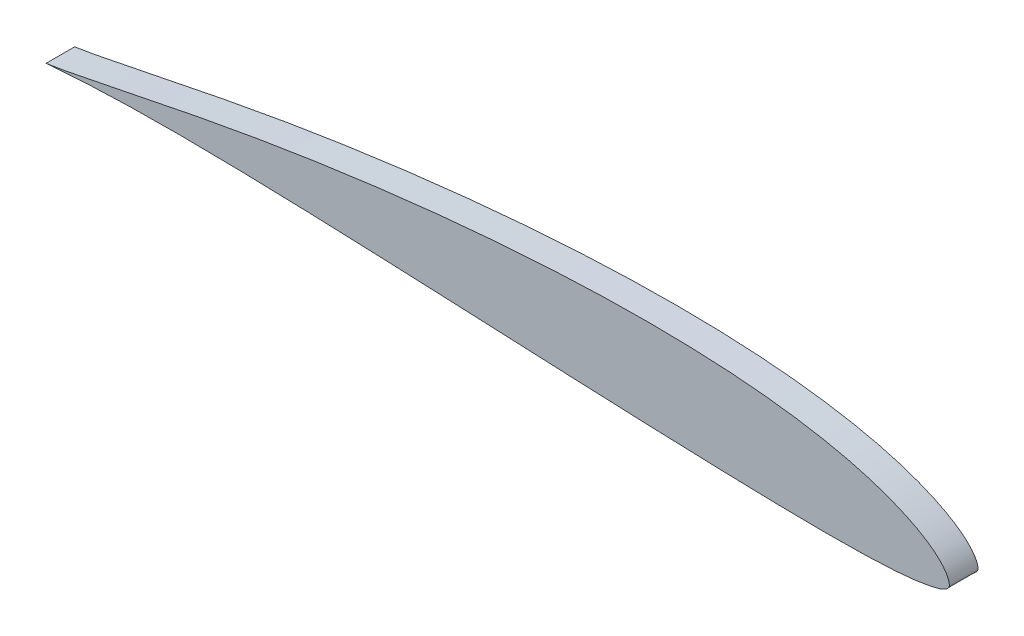
ISO-10303-21;
HEADER;
FILE_DESCRIPTION(('STEP AP214'),'2;1');
FILE_NAME('part.step','',(''),(''),'','','');
FILE_SCHEMA(('AUTOMOTIVE_DESIGN { 1 0 10303 214 1 1 1 1 }'));
ENDSEC;
DATA;
#1=APPLICATION_CONTEXT('core data for automotive mechanical design processes');
#2=APPLICATION_PROTOCOL_DEFINITION('international standard','automotive_design',2000,#1);
#3=PRODUCT_CONTEXT('',#1,'mechanical');
#4=PRODUCT('Part','Part','',(#3));
#5=PRODUCT_RELATED_PRODUCT_CATEGORY('part','',(#4));
#6=PRODUCT_DEFINITION_FORMATION('','',#4);
#7=PRODUCT_DEFINITION_CONTEXT('part definition',#1,'design');
#8=PRODUCT_DEFINITION('design','',#6,#7);
#9=PRODUCT_DEFINITION_SHAPE('','',#8);
#10=(LENGTH_UNIT() NAMED_UNIT(*) SI_UNIT(.MILLI.,.METRE.));
#11=(NAMED_UNIT(*) PLANE_ANGLE_UNIT() SI_UNIT($,.RADIAN.));
#12=(NAMED_UNIT(*) SI_UNIT($,.STERADIAN.) SOLID_ANGLE_UNIT());
#13=UNCERTAINTY_MEASURE_WITH_UNIT(LENGTH_MEASURE(1.E-05),#10,'distance_accuracy_value','');
#14=(GEOMETRIC_REPRESENTATION_CONTEXT(3) GLOBAL_UNCERTAINTY_ASSIGNED_CONTEXT((#13)) GLOBAL_UNIT_ASSIGNED_CONTEXT((#10,
#11,#12)) REPRESENTATION_CONTEXT('',''));
#15=CARTESIAN_POINT('',(0.,0.,0.));
#16=DIRECTION('',(0.,0.,1.));
#17=DIRECTION('',(1.,0.,0.));
#18=AXIS2_PLACEMENT_3D('',#15,#16,#17);
#19=CARTESIAN_POINT('',(2.3575779570362,55.8360552784786,6.35));
#20=DIRECTION('',(-0.0421856308777922,-0.999109790036832,0.));
#21=DIRECTION('',(0.999109790036832,-0.0421856308777922,0.));
#22=AXIS2_PLACEMENT_3D('',#19,#20,#21);
#23=PLANE('',#22);
#24=CARTESIAN_POINT('',(1754.97498737325,-18.165092384081,0.));
#25=DIRECTION('',(-0.0421856308777922,-0.999109790036832,0.));
#26=DIRECTION('',(0.999109790036832,-0.0421856308777922,0.));
#27=AXIS2_PLACEMENT_3D('',#24,#25,#26);
#28=ELLIPSE('',#27,3.17538763875182,3.17499999999999);
#29=CARTESIAN_POINT('',(1758.14754825028,-18.2990481149033,0.));
#30=VERTEX_POINT('',#29);
#31=EDGE_CURVE('E44',#30,#30,#28,.T.);
#32=ORIENTED_EDGE('',*,*,#31,.F.);
#33=EDGE_LOOP('',(#32));
#34=FACE_BOUND('',#33,.T.);
#35=DIRECTION('',(-0.999109790036832,0.0421856308777922,0.));
#36=VECTOR('',#35,1.);
#37=CARTESIAN_POINT('',(2.3575779570362,55.8360552784786,-6.35));
#38=LINE('',#37,#36);
#39=CARTESIAN_POINT('',(1767.6652308814,-18.7009153073702,-6.35));
#40=VERTEX_POINT('',#39);
#41=CARTESIAN_POINT('',(1742.28784221446,-17.6294002830741,-6.35));
#42=VERTEX_POINT('',#41);
#43=EDGE_CURVE('E149',#40,#42,#38,.T.);
#44=ORIENTED_EDGE('',*,*,#43,.F.);
#45=DIRECTION('',(0.,0.,-1.));
#46=VECTOR('',#45,1.);
#47=CARTESIAN_POINT('',(1767.6652308814,-18.7009153073702,6.35));
#48=LINE('',#47,#46);
#49=CARTESIAN_POINT('',(1767.6652308814,-18.7009153073702,6.35));
#50=VERTEX_POINT('',#49);
#51=EDGE_CURVE('E11',#50,#40,#48,.T.);
#52=ORIENTED_EDGE('',*,*,#51,.F.);
#53=DIRECTION('',(-0.999109790036832,0.0421856308777922,0.));
#54=VECTOR('',#53,1.);
#55=CARTESIAN_POINT('',(2.3575779570362,55.8360552784786,6.35));
#56=LINE('',#55,#54);
#57=CARTESIAN_POINT('',(1742.28784221446,-17.6294002830741,6.35));
#58=VERTEX_POINT('',#57);
#59=EDGE_CURVE('E110',#50,#58,#56,.T.);
#60=ORIENTED_EDGE('',*,*,#59,.T.);
#61=DIRECTION('',(0.,0.,-1.));
#62=VECTOR('',#61,1.);
#63=CARTESIAN_POINT('',(1742.28784221446,-17.6294002830741,6.35));
#64=LINE('',#63,#62);
#65=EDGE_CURVE('E81',#58,#42,#64,.T.);
#66=ORIENTED_EDGE('',*,*,#65,.T.);
#67=EDGE_LOOP('',(#44,#52,#60,#66));
#68=FACE_BOUND('',#67,.T.);
#69=ADVANCED_FACE('F41',(#34,#68),#23,.T.);
#70=CARTESIAN_POINT('',(1596.31021413288,-17.478209275154,6.35));
#71=CARTESIAN_POINT('',(1596.3102515309,-17.4900798795625,6.35));
#72=CARTESIAN_POINT('',(1599.1322423313,-17.2022330923903,6.35));
#73=CARTESIAN_POINT('',(1602.03182260984,-16.9907136810287,6.35));
#74=CARTESIAN_POINT('',(1609.10720109062,-16.4816305190965,6.35));
#75=CARTESIAN_POINT('',(1617.84346830049,-16.0122581327614,6.35));
#76=CARTESIAN_POINT('',(1629.29972086853,-15.5760026593076,6.35));
#77=CARTESIAN_POINT('',(1642.81673493414,-15.3091150572676,6.35));
#78=CARTESIAN_POINT('',(1658.33448053557,-15.2864051468592,6.35));
#79=CARTESIAN_POINT('',(1675.53154740055,-15.4897580032224,6.35));
#80=CARTESIAN_POINT('',(1694.16050142952,-15.9168759779006,6.35));
#81=CARTESIAN_POINT('',(1713.95156909246,-16.5363404784246,6.35));
#82=CARTESIAN_POINT('',(1734.64638447524,-17.3145316205594,6.35));
#83=CARTESIAN_POINT('',(1755.98575421537,-18.1841042418055,6.35));
#84=CARTESIAN_POINT('',(1777.70838338736,-19.1419446781197,6.35));
#85=CARTESIAN_POINT('',(1799.55769772036,-20.1293541585242,6.35));
#86=CARTESIAN_POINT('',(1821.2831429715,-21.1012838048597,6.35));
#87=CARTESIAN_POINT('',(1842.64516709738,-22.0116275533366,6.35));
#88=CARTESIAN_POINT('',(1863.40548202887,-22.8529134431896,6.35));
#89=CARTESIAN_POINT('',(1883.33023430574,-23.5822681473132,6.35));
#90=CARTESIAN_POINT('',(1902.18807730714,-24.1899386424968,6.35));
#91=CARTESIAN_POINT('',(1919.75949569216,-24.6424497284501,6.35));
#92=CARTESIAN_POINT('',(1935.8518352752,-24.8793410332257,6.35));
#93=CARTESIAN_POINT('',(1950.29422526534,-24.8739135013043,6.35));
#94=CARTESIAN_POINT('',(1962.94157873014,-24.6070759190933,6.35));
#95=CARTESIAN_POINT('',(1973.68021727723,-24.0183120574947,6.35));
#96=CARTESIAN_POINT('',(1982.39869388507,-23.1985552094744,6.35));
#97=CARTESIAN_POINT('',(1989.09296287627,-21.9114816071557,6.35));
#98=CARTESIAN_POINT('',(1993.57350987807,-20.7570563820821,6.35));
#99=CARTESIAN_POINT('',(1996.6806748032,-18.4574056102938,6.35));
#100=CARTESIAN_POINT('',(1995.81152486995,-15.0236569753175,6.35));
#101=CARTESIAN_POINT('',(1993.77484340238,-11.7907350557363,6.35));
#102=CARTESIAN_POINT('',(1990.03603736107,-8.11350883684481,6.35));
#103=CARTESIAN_POINT('',(1984.73373764165,-4.43183126644344,6.35));
#104=CARTESIAN_POINT('',(1977.84455466072,-0.738000891407876,6.35));
#105=CARTESIAN_POINT('',(1969.41765671903,2.8082946719217,6.35));
#106=CARTESIAN_POINT('',(1959.49253908317,6.11304090342494,6.35));
#107=CARTESIAN_POINT('',(1948.10296055372,9.02941444658797,6.35));
#108=CARTESIAN_POINT('',(1935.32435887673,11.5243026466393,6.35));
#109=CARTESIAN_POINT('',(1921.24125431776,13.586927955176,6.35));
#110=CARTESIAN_POINT('',(1905.94807917216,15.1257003058072,6.35));
#111=CARTESIAN_POINT('',(1889.56068995788,16.1513180356543,6.35));
#112=CARTESIAN_POINT('',(1872.20952379832,16.6653210663825,6.35));
#113=CARTESIAN_POINT('',(1854.04601062752,16.6739586592146,6.35));
#114=CARTESIAN_POINT('',(1835.23493639232,16.1998909506919,6.35));
#115=CARTESIAN_POINT('',(1815.95077146485,15.2635327555171,6.35));
#116=CARTESIAN_POINT('',(1796.37573706149,13.9033351938215,6.35));
#117=CARTESIAN_POINT('',(1776.70299506491,12.1582992439741,6.35));
#118=CARTESIAN_POINT('',(1757.13134712081,10.0744625588622,6.35));
#119=CARTESIAN_POINT('',(1737.85939642865,7.71225563047655,6.35));
#120=CARTESIAN_POINT('',(1719.08684801041,5.11473875154889,6.35));
#121=CARTESIAN_POINT('',(1701.00473801196,2.34073982283165,6.35));
#122=CARTESIAN_POINT('',(1683.79671044662,-0.560040691334636,6.35));
#123=CARTESIAN_POINT('',(1667.62831922199,-3.51396391232352,6.35));
#124=CARTESIAN_POINT('',(1652.66782034166,-6.42930574927058,6.35));
#125=CARTESIAN_POINT('',(1639.06708513807,-9.19163881630794,6.35));
#126=CARTESIAN_POINT('',(1627.05920043915,-11.6691543312357,6.35));
#127=CARTESIAN_POINT('',(1616.68795805122,-13.7848214634737,6.35));
#128=CARTESIAN_POINT('',(1608.59256465579,-15.3932547451612,6.35));
#129=CARTESIAN_POINT('',(1601.88092298677,-16.5823188951291,6.35));
#130=CARTESIAN_POINT('',(1599.08053019508,-17.0906211344314,6.35));
#131=CARTESIAN_POINT('',(1596.31017694321,-17.466404802761,6.35));
#132=CARTESIAN_POINT('',(1596.31021413288,-17.478209275154,6.35));
#133=B_SPLINE_CURVE_WITH_KNOTS('',3,(#70,#71,#72,#73,#74,#75,#76,#77,#78,#79,#80,#81,#82,#83,
#84,#85,#86,#87,#88,#89,#90,#91,#92,#93,#94,#95,#96,#97,#98,#99,#100,#101,#102,#103,#104,#105,
#106,#107,#108,#109,#110,#111,#112,#113,#114,#115,#116,#117,#118,#119,#120,#121,#122,#123,#124,
#125,#126,#127,#128,#129,#130,#131,#132),.UNSPECIFIED.,.T.,.F.,(4,1,1,1,1,1,1,1,1,1,1,1,1,1,1,1,
1,1,1,1,1,1,1,1,1,1,1,1,1,1,1,1,1,1,1,1,1,1,1,1,1,1,1,1,1,1,1,1,1,1,1,1,1,1,1,1,1,1,1,1,4),(0.,
0.00162827255922005,0.00649050965473852,0.0145193836673184,0.0256267718050507,
0.0396659782037578,0.0564158680126472,0.0755751983771271,0.0968144767188099,0.119812493963671,
0.1442464295869,0.169791911279109,0.196137839472828,0.222959252874957,0.249929689016993,
0.276747064878309,0.303109783270562,0.328732166600227,0.353323186514224,0.376592645275716,
0.398269788623994,0.418104249413604,0.435907310477593,0.451493631474574,0.464728190365783,
0.47551563303222,0.483813435244795,0.489622354181594,0.493000170515783,0.496319033276272,
0.50112136018567,0.507407277714504,0.515327375532837,0.52490812765617,0.536144750255862,
0.548990967810824,0.563425422459707,0.57944589810611,0.596955554448896,0.615864818248053,
0.636077717109341,0.657458391249912,0.679831384800272,0.703012205861105,0.726802900260427,
0.750982325596448,0.77532642647073,0.799588584319813,0.823519224580182,0.846883028826477,
0.869432574938011,0.890938901752127,0.911197778131604,0.930003617124546,0.947123678392186,
0.962312644452633,0.975299445140062,0.985817342446044,0.993591880191323,0.99838079866768,1.),.UNSPECIFIED.);
#134=DIRECTION('',(0.,0.,-1.));
#135=VECTOR('',#134,1.);
#136=SURFACE_OF_LINEAR_EXTRUSION('',#133,#135);
#137=CARTESIAN_POINT('',(1596.31021413288,-17.478209275154,-6.35));
#138=CARTESIAN_POINT('',(1596.3102515309,-17.4900798795625,-6.35));
#139=CARTESIAN_POINT('',(1599.1322423313,-17.2022330923903,-6.35));
#140=CARTESIAN_POINT('',(1602.03182260984,-16.9907136810287,-6.35));
#141=CARTESIAN_POINT('',(1609.10720109062,-16.4816305190965,-6.35));
#142=CARTESIAN_POINT('',(1617.84346830049,-16.0122581327614,-6.35));
#143=CARTESIAN_POINT('',(1629.29972086853,-15.5760026593076,-6.35));
#144=CARTESIAN_POINT('',(1642.81673493414,-15.3091150572676,-6.35));
#145=CARTESIAN_POINT('',(1658.33448053557,-15.2864051468592,-6.35));
#146=CARTESIAN_POINT('',(1675.53154740055,-15.4897580032224,-6.35));
#147=CARTESIAN_POINT('',(1694.16050142952,-15.9168759779006,-6.35));
#148=CARTESIAN_POINT('',(1713.95156909246,-16.5363404784246,-6.35));
#149=CARTESIAN_POINT('',(1734.64638447524,-17.3145316205594,-6.35));
#150=CARTESIAN_POINT('',(1755.98575421537,-18.1841042418055,-6.35));
#151=CARTESIAN_POINT('',(1777.70838338736,-19.1419446781197,-6.35));
#152=CARTESIAN_POINT('',(1799.55769772036,-20.1293541585242,-6.35));
#153=CARTESIAN_POINT('',(1821.2831429715,-21.1012838048597,-6.35));
#154=CARTESIAN_POINT('',(1842.64516709738,-22.0116275533366,-6.35));
#155=CARTESIAN_POINT('',(1863.40548202887,-22.8529134431896,-6.35));
#156=CARTESIAN_POINT('',(1883.33023430574,-23.5822681473132,-6.35));
#157=CARTESIAN_POINT('',(1902.18807730714,-24.1899386424968,-6.35));
#158=CARTESIAN_POINT('',(1919.75949569216,-24.6424497284501,-6.35));
#159=CARTESIAN_POINT('',(1935.8518352752,-24.8793410332257,-6.35));
#160=CARTESIAN_POINT('',(1950.29422526534,-24.8739135013043,-6.35));
#161=CARTESIAN_POINT('',(1962.94157873014,-24.6070759190933,-6.35));
#162=CARTESIAN_POINT('',(1973.68021727723,-24.0183120574947,-6.35));
#163=CARTESIAN_POINT('',(1982.39869388507,-23.1985552094744,-6.35));
#164=CARTESIAN_POINT('',(1989.09296287627,-21.9114816071557,-6.35));
#165=CARTESIAN_POINT('',(1993.57350987807,-20.7570563820821,-6.35));
#166=CARTESIAN_POINT('',(1996.6806748032,-18.4574056102938,-6.35));
#167=CARTESIAN_POINT('',(1995.81152486995,-15.0236569753175,-6.35));
#168=CARTESIAN_POINT('',(1993.77484340238,-11.7907350557363,-6.35));
#169=CARTESIAN_POINT('',(1990.03603736107,-8.11350883684481,-6.35));
#170=CARTESIAN_POINT('',(1984.73373764165,-4.43183126644344,-6.35));
#171=CARTESIAN_POINT('',(1977.84455466072,-0.738000891407876,-6.35));
#172=CARTESIAN_POINT('',(1969.41765671903,2.8082946719217,-6.35));
#173=CARTESIAN_POINT('',(1959.49253908317,6.11304090342494,-6.35));
#174=CARTESIAN_POINT('',(1948.10296055372,9.02941444658797,-6.35));
#175=CARTESIAN_POINT('',(1935.32435887673,11.5243026466393,-6.35));
#176=CARTESIAN_POINT('',(1921.24125431776,13.586927955176,-6.35));
#177=CARTESIAN_POINT('',(1905.94807917216,15.1257003058072,-6.35));
#178=CARTESIAN_POINT('',(1889.56068995788,16.1513180356543,-6.35));
#179=CARTESIAN_POINT('',(1872.20952379832,16.6653210663825,-6.35));
#180=CARTESIAN_POINT('',(1854.04601062752,16.6739586592146,-6.35));
#181=CARTESIAN_POINT('',(1835.23493639232,16.1998909506919,-6.35));
#182=CARTESIAN_POINT('',(1815.95077146485,15.2635327555171,-6.35));
#183=CARTESIAN_POINT('',(1796.37573706149,13.9033351938215,-6.35));
#184=CARTESIAN_POINT('',(1776.70299506491,12.1582992439741,-6.35));
#185=CARTESIAN_POINT('',(1757.13134712081,10.0744625588622,-6.35));
#186=CARTESIAN_POINT('',(1737.85939642865,7.71225563047655,-6.35));
#187=CARTESIAN_POINT('',(1719.08684801041,5.11473875154889,-6.35));
#188=CARTESIAN_POINT('',(1701.00473801196,2.34073982283165,-6.35));
#189=CARTESIAN_POINT('',(1683.79671044662,-0.560040691334636,-6.35));
#190=CARTESIAN_POINT('',(1667.62831922199,-3.51396391232352,-6.35));
#191=CARTESIAN_POINT('',(1652.66782034166,-6.42930574927058,-6.35));
#192=CARTESIAN_POINT('',(1639.06708513807,-9.19163881630794,-6.35));
#193=CARTESIAN_POINT('',(1627.05920043915,-11.6691543312357,-6.35));
#194=CARTESIAN_POINT('',(1616.68795805122,-13.7848214634737,-6.35));
#195=CARTESIAN_POINT('',(1608.59256465579,-15.3932547451612,-6.35));
#196=CARTESIAN_POINT('',(1601.88092298677,-16.5823188951291,-6.35));
#197=CARTESIAN_POINT('',(1599.08053019508,-17.0906211344314,-6.35));
#198=CARTESIAN_POINT('',(1596.31017694321,-17.466404802761,-6.35));
#199=CARTESIAN_POINT('',(1596.31021413288,-17.478209275154,-6.35));
#200=B_SPLINE_CURVE_WITH_KNOTS('',3,(#137,#138,#139,#140,#141,#142,#143,#144,#145,#146,#147,
#148,#149,#150,#151,#152,#153,#154,#155,#156,#157,#158,#159,#160,#161,#162,#163,#164,#165,#166,
#167,#168,#169,#170,#171,#172,#173,#174,#175,#176,#177,#178,#179,#180,#181,#182,#183,#184,#185,
#186,#187,#188,#189,#190,#191,#192,#193,#194,#195,#196,#197,#198,#199),.UNSPECIFIED.,.T.,.F.,(4,
1,1,1,1,1,1,1,1,1,1,1,1,1,1,1,1,1,1,1,1,1,1,1,1,1,1,1,1,1,1,1,1,1,1,1,1,1,1,1,1,1,1,1,1,1,1,1,1,
1,1,1,1,1,1,1,1,1,1,1,4),(0.,0.00162827255922005,0.00649050965473852,0.0145193836673184,
0.0256267718050507,0.0396659782037578,0.0564158680126472,0.0755751983771271,0.0968144767188099,
0.119812493963671,0.1442464295869,0.169791911279109,0.196137839472828,0.222959252874957,
0.249929689016993,0.276747064878309,0.303109783270562,0.328732166600227,0.353323186514224,
0.376592645275716,0.398269788623994,0.418104249413604,0.435907310477593,0.451493631474574,
0.464728190365783,0.47551563303222,0.483813435244795,0.489622354181594,0.493000170515783,
0.496319033276272,0.50112136018567,0.507407277714504,0.515327375532837,0.52490812765617,
0.536144750255862,0.548990967810824,0.563425422459707,0.57944589810611,0.596955554448896,
0.615864818248053,0.636077717109341,0.657458391249912,0.679831384800272,0.703012205861105,
0.726802900260427,0.750982325596448,0.77532642647073,0.799588584319813,0.823519224580182,
0.846883028826477,0.869432574938011,0.890938901752127,0.911197778131604,0.930003617124546,
0.947123678392186,0.962312644452633,0.975299445140062,0.985817342446044,0.993591880191323,
0.99838079866768,1.),.UNSPECIFIED.);
#201=CARTESIAN_POINT('',(1894.67419788151,-23.9426877498647,-6.35));
#202=VERTEX_POINT('',#201);
#203=EDGE_CURVE('E152',#40,#202,#200,.T.);
#204=ORIENTED_EDGE('',*,*,#203,.T.);
#205=DIRECTION('',(0.,0.,-1.));
#206=VECTOR('',#205,1.);
#207=CARTESIAN_POINT('',(1894.67419788151,-23.9426877498647,6.35));
#208=LINE('',#207,#206);
#209=CARTESIAN_POINT('',(1894.67419788151,-23.9426877498647,6.35));
#210=VERTEX_POINT('',#209);
#211=EDGE_CURVE('E50',#210,#202,#208,.T.);
#212=ORIENTED_EDGE('',*,*,#211,.F.);
#213=EDGE_CURVE('E112',#50,#210,#133,.T.);
#214=ORIENTED_EDGE('',*,*,#213,.F.);
#215=ORIENTED_EDGE('',*,*,#51,.T.);
#216=EDGE_LOOP('',(#204,#212,#214,#215));
#217=FACE_BOUND('',#216,.T.);
#218=ADVANCED_FACE('F129',(#217),#136,.F.);
#219=CARTESIAN_POINT('',(0.701602531150922,26.3969899564991,6.35));
#220=DIRECTION('',(-0.0265695007087187,-0.999646968500425,0.));
#221=DIRECTION('',(0.999646968500425,-0.0265695007087187,0.));
#222=AXIS2_PLACEMENT_3D('',#219,#220,#221);
#223=PLANE('',#222);
#224=CARTESIAN_POINT('',(1907.36971438147,-24.2801204088655,0.));
#225=DIRECTION('',(-0.0265695007087187,-0.999646968500425,0.));
#226=DIRECTION('',(0.999646968500425,-0.0265695007087187,0.));
#227=AXIS2_PLACEMENT_3D('',#224,#225,#226);
#228=CIRCLE('',#227,3.17499999999999);
#229=CARTESIAN_POINT('',(1910.54359350645,-24.3644785736157,0.));
#230=VERTEX_POINT('',#229);
#231=EDGE_CURVE('E103',#230,#230,#228,.T.);
#232=ORIENTED_EDGE('',*,*,#231,.F.);
#233=EDGE_LOOP('',(#232));
#234=FACE_BOUND('',#233,.T.);
#235=DIRECTION('',(-0.999646968500425,0.0265695007087187,0.));
#236=VECTOR('',#235,1.);
#237=CARTESIAN_POINT('',(0.701602531150922,26.3969899564991,-6.35));
#238=LINE('',#237,#236);
#239=CARTESIAN_POINT('',(1920.06523088142,-24.6175530678662,-6.35));
#240=VERTEX_POINT('',#239);
#241=EDGE_CURVE('E154',#240,#202,#238,.T.);
#242=ORIENTED_EDGE('',*,*,#241,.F.);
#243=DIRECTION('',(0.,0.,-1.));
#244=VECTOR('',#243,1.);
#245=CARTESIAN_POINT('',(1920.06523088142,-24.6175530678662,6.35));
#246=LINE('',#245,#244);
#247=CARTESIAN_POINT('',(1920.06523088142,-24.6175530678662,6.35));
#248=VERTEX_POINT('',#247);
#249=EDGE_CURVE('E74',#248,#240,#246,.T.);
#250=ORIENTED_EDGE('',*,*,#249,.F.);
#251=DIRECTION('',(-0.999646968500425,0.0265695007087187,0.));
#252=VECTOR('',#251,1.);
#253=CARTESIAN_POINT('',(0.701602531150922,26.3969899564991,6.35));
#254=LINE('',#253,#252);
#255=EDGE_CURVE('E118',#248,#210,#254,.T.);
#256=ORIENTED_EDGE('',*,*,#255,.T.);
#257=ORIENTED_EDGE('',*,*,#211,.T.);
#258=EDGE_LOOP('',(#242,#250,#256,#257));
#259=FACE_BOUND('',#258,.T.);
#260=ADVANCED_FACE('F128',(#234,#259),#223,.T.);
#261=EDGE_CURVE('E113',#240,#42,#200,.T.);
#262=ORIENTED_EDGE('',*,*,#261,.T.);
#263=ORIENTED_EDGE('',*,*,#65,.F.);
#264=EDGE_CURVE('E58',#248,#58,#133,.T.);
#265=ORIENTED_EDGE('',*,*,#264,.F.);
#266=ORIENTED_EDGE('',*,*,#249,.T.);
#267=EDGE_LOOP('',(#262,#263,#265,#266));
#268=FACE_BOUND('',#267,.T.);
#269=ADVANCED_FACE('F124',(#268),#136,.F.);
#270=CARTESIAN_POINT('',(0.,0.,6.35));
#271=DIRECTION('',(0.,0.,1.));
#272=DIRECTION('',(1.,0.,0.));
#273=AXIS2_PLACEMENT_3D('',#270,#271,#272);
#274=PLANE('',#273);
#275=ORIENTED_EDGE('',*,*,#59,.F.);
#276=ORIENTED_EDGE('',*,*,#213,.T.);
#277=ORIENTED_EDGE('',*,*,#255,.F.);
#278=ORIENTED_EDGE('',*,*,#264,.T.);
#279=EDGE_LOOP('',(#275,#276,#277,#278));
#280=FACE_BOUND('',#279,.T.);
#281=ADVANCED_FACE('F127',(#280),#274,.T.);
#282=CARTESIAN_POINT('',(0.,0.,-6.35));
#283=DIRECTION('',(0.,0.,1.));
#284=DIRECTION('',(1.,0.,0.));
#285=AXIS2_PLACEMENT_3D('',#282,#283,#284);
#286=PLANE('',#285);
#287=ORIENTED_EDGE('',*,*,#43,.T.);
#288=ORIENTED_EDGE('',*,*,#261,.F.);
#289=ORIENTED_EDGE('',*,*,#241,.T.);
#290=ORIENTED_EDGE('',*,*,#203,.F.);
#291=EDGE_LOOP('',(#287,#288,#289,#290));
#292=FACE_BOUND('',#291,.T.);
#293=ADVANCED_FACE('F130',(#292),#286,.F.);
#294=CARTESIAN_POINT('',(1755.25758543384,-7.53266471158802,0.));
#295=DIRECTION('',(-0.0265695007087187,-0.999646968500425,0.));
#296=DIRECTION('',(0.999646968500425,-0.0265695007087187,0.));
#297=AXIS2_PLACEMENT_3D('',#294,#295,#296);
#298=CONICAL_SURFACE('',#297,3.17499999999999,1.02974425867665);
#299=CARTESIAN_POINT('',(1755.30827293293,-5.62560573582858,0.));
#300=VERTEX_POINT('',#299);
#301=VERTEX_LOOP('',#300);
#302=FACE_BOUND('',#301,.T.);
#303=CARTESIAN_POINT('',(1755.25758543384,-7.53266471158802,0.));
#304=DIRECTION('',(-0.0265695007087187,-0.999646968500425,0.));
#305=DIRECTION('',(0.999646968500425,-0.0265695007087187,0.));
#306=AXIS2_PLACEMENT_3D('',#303,#304,#305);
#307=CIRCLE('',#306,3.17499999999999);
#308=CARTESIAN_POINT('',(1758.43146455883,-7.61702287633821,0.));
#309=VERTEX_POINT('',#308);
#310=EDGE_CURVE('E102',#309,#309,#307,.T.);
#311=ORIENTED_EDGE('',*,*,#310,.T.);
#312=EDGE_LOOP('',(#311));
#313=FACE_BOUND('',#312,.T.);
#314=ADVANCED_FACE('F172',(#302,#313),#298,.F.);
#315=CARTESIAN_POINT('',(1754.92015277484,-20.2281812115434,0.));
#316=DIRECTION('',(-0.0265695007087187,-0.999646968500425,0.));
#317=DIRECTION('',(0.999646968500425,-0.0265695007087187,0.));
#318=AXIS2_PLACEMENT_3D('',#315,#316,#317);
#319=CYLINDRICAL_SURFACE('',#318,3.17499999999999);
#320=ORIENTED_EDGE('',*,*,#31,.T.);
#321=EDGE_LOOP('',(#320));
#322=FACE_BOUND('',#321,.T.);
#323=ORIENTED_EDGE('',*,*,#310,.F.);
#324=EDGE_LOOP('',(#323));
#325=FACE_BOUND('',#324,.T.);
#326=ADVANCED_FACE('F96',(#322,#325),#319,.F.);
#327=CARTESIAN_POINT('',(1907.70714704047,-11.5846039089101,0.));
#328=DIRECTION('',(-0.0265695007087187,-0.999646968500425,0.));
#329=DIRECTION('',(0.999646968500425,-0.0265695007087187,0.));
#330=AXIS2_PLACEMENT_3D('',#327,#328,#329);
#331=CONICAL_SURFACE('',#330,3.17499999999999,1.02974425867665);
#332=CARTESIAN_POINT('',(1907.75783453956,-9.67754493315065,0.));
#333=VERTEX_POINT('',#332);
#334=VERTEX_LOOP('',#333);
#335=FACE_BOUND('',#334,.T.);
#336=CARTESIAN_POINT('',(1907.70714704047,-11.5846039089101,0.));
#337=DIRECTION('',(-0.0265695007087187,-0.999646968500425,0.));
#338=DIRECTION('',(0.999646968500425,-0.0265695007087187,0.));
#339=AXIS2_PLACEMENT_3D('',#336,#337,#338);
#340=CIRCLE('',#339,3.17499999999999);
#341=CARTESIAN_POINT('',(1910.88102616546,-11.6689620736603,0.));
#342=VERTEX_POINT('',#341);
#343=EDGE_CURVE('E100',#342,#342,#340,.T.);
#344=ORIENTED_EDGE('',*,*,#343,.T.);
#345=EDGE_LOOP('',(#344));
#346=FACE_BOUND('',#345,.T.);
#347=ADVANCED_FACE('F92',(#335,#346),#331,.F.);
#348=CARTESIAN_POINT('',(1907.36971438147,-24.2801204088655,0.));
#349=DIRECTION('',(-0.0265695007087187,-0.999646968500425,0.));
#350=DIRECTION('',(0.999646968500425,-0.0265695007087187,0.));
#351=AXIS2_PLACEMENT_3D('',#348,#349,#350);
#352=CYLINDRICAL_SURFACE('',#351,3.17499999999999);
#353=ORIENTED_EDGE('',*,*,#343,.F.);
#354=EDGE_LOOP('',(#353));
#355=FACE_BOUND('',#354,.T.);
#356=ORIENTED_EDGE('',*,*,#231,.T.);
#357=EDGE_LOOP('',(#356));
#358=FACE_BOUND('',#357,.T.);
#359=ADVANCED_FACE('F95',(#355,#358),#352,.F.);
#360=CLOSED_SHELL('',(#69,#218,#260,#269,#281,#293,#314,#326,#347,#359));
#361=MANIFOLD_SOLID_BREP('B2',#360);
#362=ADVANCED_BREP_SHAPE_REPRESENTATION('',(#18,#361),#14);
#363=SHAPE_DEFINITION_REPRESENTATION(#9,#362);
ENDSEC;
END-ISO-10303-21;
